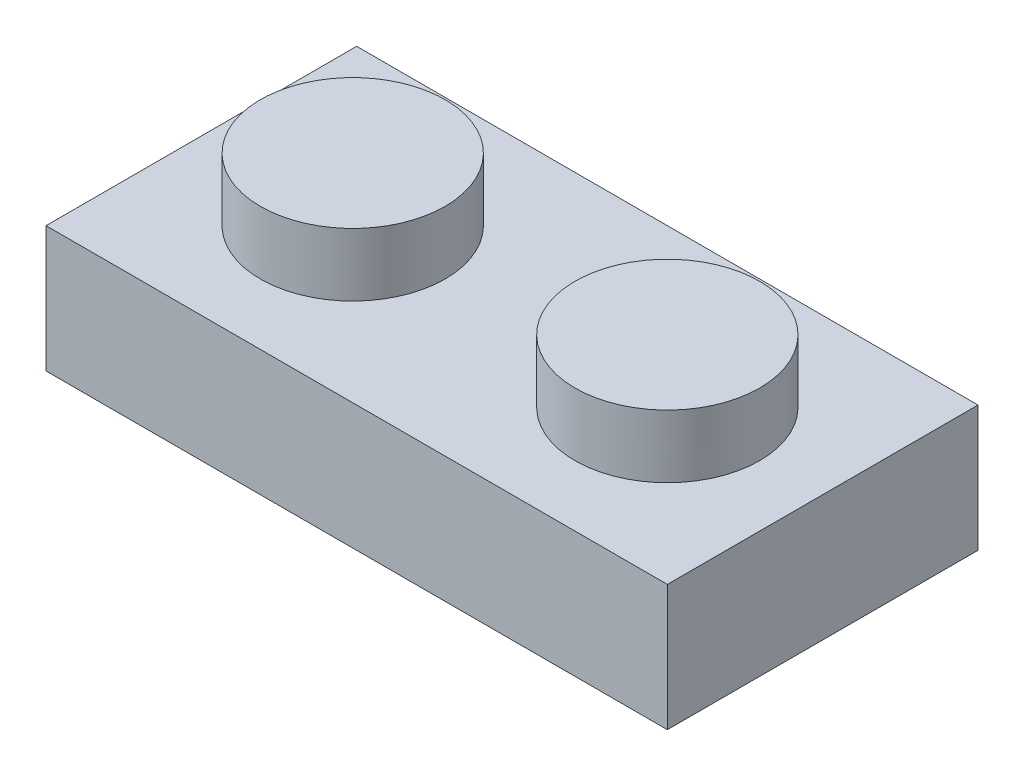
ISO-10303-21;
HEADER;
FILE_DESCRIPTION(('STEP AP214'),'2;1');
FILE_NAME('part.step','',(''),(''),'','','');
FILE_SCHEMA(('AUTOMOTIVE_DESIGN { 1 0 10303 214 1 1 1 1 }'));
ENDSEC;
DATA;
#1=APPLICATION_CONTEXT('core data for automotive mechanical design processes');
#2=APPLICATION_PROTOCOL_DEFINITION('international standard','automotive_design',2000,#1);
#3=PRODUCT_CONTEXT('',#1,'mechanical');
#4=PRODUCT('Part','Part','',(#3));
#5=PRODUCT_RELATED_PRODUCT_CATEGORY('part','',(#4));
#6=PRODUCT_DEFINITION_FORMATION('','',#4);
#7=PRODUCT_DEFINITION_CONTEXT('part definition',#1,'design');
#8=PRODUCT_DEFINITION('design','',#6,#7);
#9=PRODUCT_DEFINITION_SHAPE('','',#8);
#10=(LENGTH_UNIT() NAMED_UNIT(*) SI_UNIT(.MILLI.,.METRE.));
#11=(NAMED_UNIT(*) PLANE_ANGLE_UNIT() SI_UNIT($,.RADIAN.));
#12=(NAMED_UNIT(*) SI_UNIT($,.STERADIAN.) SOLID_ANGLE_UNIT());
#13=UNCERTAINTY_MEASURE_WITH_UNIT(LENGTH_MEASURE(1.E-05),#10,'distance_accuracy_value','');
#14=(GEOMETRIC_REPRESENTATION_CONTEXT(3) GLOBAL_UNCERTAINTY_ASSIGNED_CONTEXT((#13)) GLOBAL_UNIT_ASSIGNED_CONTEXT((#10,
#11,#12)) REPRESENTATION_CONTEXT('',''));
#15=CARTESIAN_POINT('',(0.,0.,0.));
#16=DIRECTION('',(0.,0.,1.));
#17=DIRECTION('',(1.,0.,0.));
#18=AXIS2_PLACEMENT_3D('',#15,#16,#17);
#19=CARTESIAN_POINT('',(16.4819672131147,0.,7.9));
#20=DIRECTION('',(-1.,0.,0.));
#21=DIRECTION('',(0.,0.,1.));
#22=AXIS2_PLACEMENT_3D('',#19,#20,#21);
#23=PLANE('',#22);
#24=DIRECTION('',(0.,-1.,0.));
#25=VECTOR('',#24,1.);
#26=CARTESIAN_POINT('',(16.4819672131147,35.7679015680186,0.));
#27=LINE('',#26,#25);
#28=CARTESIAN_POINT('',(16.4819672131147,3.2,0.));
#29=VERTEX_POINT('',#28);
#30=CARTESIAN_POINT('',(16.4819672131147,0.,0.));
#31=VERTEX_POINT('',#30);
#32=EDGE_CURVE('E215',#29,#31,#27,.T.);
#33=ORIENTED_EDGE('',*,*,#32,.F.);
#34=DIRECTION('',(0.,0.,-1.));
#35=VECTOR('',#34,1.);
#36=CARTESIAN_POINT('',(16.4819672131147,3.2,7.9));
#37=LINE('',#36,#35);
#38=CARTESIAN_POINT('',(16.4819672131147,3.2,7.9));
#39=VERTEX_POINT('',#38);
#40=EDGE_CURVE('E162',#39,#29,#37,.T.);
#41=ORIENTED_EDGE('',*,*,#40,.F.);
#42=DIRECTION('',(0.,1.,0.));
#43=VECTOR('',#42,1.);
#44=CARTESIAN_POINT('',(16.4819672131147,0.,7.9));
#45=LINE('',#44,#43);
#46=CARTESIAN_POINT('',(16.4819672131147,0.,7.9));
#47=VERTEX_POINT('',#46);
#48=EDGE_CURVE('E155',#47,#39,#45,.T.);
#49=ORIENTED_EDGE('',*,*,#48,.F.);
#50=DIRECTION('',(0.,0.,-1.));
#51=VECTOR('',#50,1.);
#52=CARTESIAN_POINT('',(16.4819672131147,0.,7.9));
#53=LINE('',#52,#51);
#54=EDGE_CURVE('E165',#47,#31,#53,.T.);
#55=ORIENTED_EDGE('',*,*,#54,.T.);
#56=EDGE_LOOP('',(#33,#41,#49,#55));
#57=FACE_BOUND('',#56,.T.);
#58=ADVANCED_FACE('F45',(#57),#23,.F.);
#59=CARTESIAN_POINT('',(0.681967213114738,0.,7.9));
#60=DIRECTION('',(0.,1.,0.));
#61=DIRECTION('',(0.,0.,1.));
#62=AXIS2_PLACEMENT_3D('',#59,#60,#61);
#63=PLANE('',#62);
#64=DIRECTION('',(0.,0.,-1.));
#65=VECTOR('',#64,1.);
#66=CARTESIAN_POINT('',(0.681967213114738,0.,7.9));
#67=LINE('',#66,#65);
#68=CARTESIAN_POINT('',(0.681967213114738,0.,7.9));
#69=VERTEX_POINT('',#68);
#70=CARTESIAN_POINT('',(0.681967213114738,0.,0.));
#71=VERTEX_POINT('',#70);
#72=EDGE_CURVE('E168',#69,#71,#67,.T.);
#73=ORIENTED_EDGE('',*,*,#72,.T.);
#74=DIRECTION('',(-1.,0.,0.));
#75=VECTOR('',#74,1.);
#76=CARTESIAN_POINT('',(0.681967213114738,0.,0.));
#77=LINE('',#76,#75);
#78=EDGE_CURVE('E203',#31,#71,#77,.T.);
#79=ORIENTED_EDGE('',*,*,#78,.F.);
#80=ORIENTED_EDGE('',*,*,#54,.F.);
#81=DIRECTION('',(1.,0.,0.));
#82=VECTOR('',#81,1.);
#83=CARTESIAN_POINT('',(0.681967213114738,0.,7.9));
#84=LINE('',#83,#82);
#85=EDGE_CURVE('E153',#69,#47,#84,.T.);
#86=ORIENTED_EDGE('',*,*,#85,.F.);
#87=EDGE_LOOP('',(#73,#79,#80,#86));
#88=FACE_BOUND('',#87,.T.);
#89=DIRECTION('',(-1.,0.,0.));
#90=VECTOR('',#89,1.);
#91=CARTESIAN_POINT('',(7.38292019553601,0.,1.19904701757875));
#92=LINE('',#91,#90);
#93=CARTESIAN_POINT('',(15.2819672131147,0.,1.19904701757875));
#94=VERTEX_POINT('',#93);
#95=CARTESIAN_POINT('',(1.88196721311474,0.,1.19904701757875));
#96=VERTEX_POINT('',#95);
#97=EDGE_CURVE('E112',#94,#96,#92,.T.);
#98=ORIENTED_EDGE('',*,*,#97,.T.);
#99=DIRECTION('',(0.,0.,-1.));
#100=VECTOR('',#99,1.);
#101=CARTESIAN_POINT('',(1.88196721311474,0.,7.9));
#102=LINE('',#101,#100);
#103=CARTESIAN_POINT('',(1.88196721311474,0.,6.7));
#104=VERTEX_POINT('',#103);
#105=EDGE_CURVE('E117',#104,#96,#102,.T.);
#106=ORIENTED_EDGE('',*,*,#105,.F.);
#107=DIRECTION('',(1.,0.,0.));
#108=VECTOR('',#107,1.);
#109=CARTESIAN_POINT('',(0.,0.,6.7));
#110=LINE('',#109,#108);
#111=CARTESIAN_POINT('',(15.2819672131147,0.,6.7));
#112=VERTEX_POINT('',#111);
#113=EDGE_CURVE('E143',#104,#112,#110,.T.);
#114=ORIENTED_EDGE('',*,*,#113,.T.);
#115=DIRECTION('',(0.,0.,-1.));
#116=VECTOR('',#115,1.);
#117=CARTESIAN_POINT('',(15.2819672131147,0.,7.9));
#118=LINE('',#117,#116);
#119=EDGE_CURVE('E118',#112,#94,#118,.T.);
#120=ORIENTED_EDGE('',*,*,#119,.T.);
#121=EDGE_LOOP('',(#98,#106,#114,#120));
#122=FACE_BOUND('',#121,.T.);
#123=ADVANCED_FACE('F114',(#88,#122),#63,.F.);
#124=CARTESIAN_POINT('',(0.681967213114738,3.2,7.9));
#125=DIRECTION('',(0.,-1.,0.));
#126=DIRECTION('',(1.,0.,0.));
#127=AXIS2_PLACEMENT_3D('',#124,#125,#126);
#128=PLANE('',#127);
#129=CARTESIAN_POINT('',(12.5819672131147,3.2,4.));
#130=DIRECTION('',(0.,-1.,0.));
#131=DIRECTION('',(1.,0.,0.));
#132=AXIS2_PLACEMENT_3D('',#129,#130,#131);
#133=CIRCLE('',#132,2.35);
#134=CARTESIAN_POINT('',(14.9319672131147,3.2,4.));
#135=VERTEX_POINT('',#134);
#136=EDGE_CURVE('E174',#135,#135,#133,.F.);
#137=ORIENTED_EDGE('',*,*,#136,.F.);
#138=EDGE_LOOP('',(#137));
#139=FACE_BOUND('',#138,.T.);
#140=CARTESIAN_POINT('',(4.58196721311474,3.2,4.));
#141=DIRECTION('',(0.,-1.,0.));
#142=DIRECTION('',(1.,0.,0.));
#143=AXIS2_PLACEMENT_3D('',#140,#141,#142);
#144=CIRCLE('',#143,2.35);
#145=CARTESIAN_POINT('',(6.93196721311474,3.2,4.));
#146=VERTEX_POINT('',#145);
#147=EDGE_CURVE('E171',#146,#146,#144,.F.);
#148=ORIENTED_EDGE('',*,*,#147,.F.);
#149=EDGE_LOOP('',(#148));
#150=FACE_BOUND('',#149,.T.);
#151=DIRECTION('',(1.,0.,0.));
#152=VECTOR('',#151,1.);
#153=CARTESIAN_POINT('',(0.681967213114738,3.2,0.));
#154=LINE('',#153,#152);
#155=CARTESIAN_POINT('',(0.681967213114738,3.2,0.));
#156=VERTEX_POINT('',#155);
#157=EDGE_CURVE('E196',#156,#29,#154,.T.);
#158=ORIENTED_EDGE('',*,*,#157,.F.);
#159=DIRECTION('',(0.,0.,-1.));
#160=VECTOR('',#159,1.);
#161=CARTESIAN_POINT('',(0.681967213114738,3.2,7.9));
#162=LINE('',#161,#160);
#163=CARTESIAN_POINT('',(0.681967213114738,3.2,7.9));
#164=VERTEX_POINT('',#163);
#165=EDGE_CURVE('E159',#164,#156,#162,.T.);
#166=ORIENTED_EDGE('',*,*,#165,.F.);
#167=DIRECTION('',(-1.,0.,0.));
#168=VECTOR('',#167,1.);
#169=CARTESIAN_POINT('',(0.681967213114738,3.2,7.9));
#170=LINE('',#169,#168);
#171=EDGE_CURVE('E157',#39,#164,#170,.T.);
#172=ORIENTED_EDGE('',*,*,#171,.F.);
#173=ORIENTED_EDGE('',*,*,#40,.T.);
#174=EDGE_LOOP('',(#158,#166,#172,#173));
#175=FACE_BOUND('',#174,.T.);
#176=ADVANCED_FACE('F187',(#139,#150,#175),#128,.F.);
#177=CARTESIAN_POINT('',(15.2819672131147,0.,7.9));
#178=DIRECTION('',(-1.,0.,0.));
#179=DIRECTION('',(0.,0.,1.));
#180=AXIS2_PLACEMENT_3D('',#177,#178,#179);
#181=PLANE('',#180);
#182=DIRECTION('',(0.,-1.,0.));
#183=VECTOR('',#182,1.);
#184=CARTESIAN_POINT('',(15.2819672131147,2.,1.19904701757875));
#185=LINE('',#184,#183);
#186=CARTESIAN_POINT('',(15.2819672131147,2.,1.19904701757875));
#187=VERTEX_POINT('',#186);
#188=EDGE_CURVE('E61',#187,#94,#185,.T.);
#189=ORIENTED_EDGE('',*,*,#188,.T.);
#190=ORIENTED_EDGE('',*,*,#119,.F.);
#191=DIRECTION('',(0.,1.,0.));
#192=VECTOR('',#191,1.);
#193=CARTESIAN_POINT('',(15.2819672131147,0.,6.7));
#194=LINE('',#193,#192);
#195=CARTESIAN_POINT('',(15.2819672131147,2.,6.7));
#196=VERTEX_POINT('',#195);
#197=EDGE_CURVE('E145',#112,#196,#194,.T.);
#198=ORIENTED_EDGE('',*,*,#197,.T.);
#199=DIRECTION('',(0.,0.,-1.));
#200=VECTOR('',#199,1.);
#201=CARTESIAN_POINT('',(15.2819672131147,2.,7.9));
#202=LINE('',#201,#200);
#203=EDGE_CURVE('E137',#196,#187,#202,.T.);
#204=ORIENTED_EDGE('',*,*,#203,.T.);
#205=EDGE_LOOP('',(#189,#190,#198,#204));
#206=FACE_BOUND('',#205,.T.);
#207=ADVANCED_FACE('F190',(#206),#181,.T.);
#208=CARTESIAN_POINT('',(0.681967213114738,2.,7.9));
#209=DIRECTION('',(0.,-1.,0.));
#210=DIRECTION('',(1.,0.,0.));
#211=AXIS2_PLACEMENT_3D('',#208,#209,#210);
#212=PLANE('',#211);
#213=CARTESIAN_POINT('',(8.58196721311474,2.,4.));
#214=DIRECTION('',(0.,-1.,0.));
#215=DIRECTION('',(1.,0.,0.));
#216=AXIS2_PLACEMENT_3D('',#213,#214,#215);
#217=CIRCLE('',#216,1.25);
#218=CARTESIAN_POINT('',(9.83196721311474,2.,4.));
#219=VERTEX_POINT('',#218);
#220=EDGE_CURVE('E49',#219,#219,#217,.F.);
#221=ORIENTED_EDGE('',*,*,#220,.T.);
#222=EDGE_LOOP('',(#221));
#223=FACE_BOUND('',#222,.T.);
#224=DIRECTION('',(0.,0.,-1.));
#225=VECTOR('',#224,1.);
#226=CARTESIAN_POINT('',(1.88196721311474,2.,7.9));
#227=LINE('',#226,#225);
#228=CARTESIAN_POINT('',(1.88196721311474,2.,6.7));
#229=VERTEX_POINT('',#228);
#230=CARTESIAN_POINT('',(1.88196721311474,2.,1.19904701757875));
#231=VERTEX_POINT('',#230);
#232=EDGE_CURVE('E224',#229,#231,#227,.T.);
#233=ORIENTED_EDGE('',*,*,#232,.T.);
#234=DIRECTION('',(-1.,0.,0.));
#235=VECTOR('',#234,1.);
#236=CARTESIAN_POINT('',(7.38292019553601,2.,1.19904701757875));
#237=LINE('',#236,#235);
#238=EDGE_CURVE('E69',#187,#231,#237,.T.);
#239=ORIENTED_EDGE('',*,*,#238,.F.);
#240=ORIENTED_EDGE('',*,*,#203,.F.);
#241=DIRECTION('',(-1.,0.,0.));
#242=VECTOR('',#241,1.);
#243=CARTESIAN_POINT('',(0.,2.,6.7));
#244=LINE('',#243,#242);
#245=EDGE_CURVE('E226',#196,#229,#244,.T.);
#246=ORIENTED_EDGE('',*,*,#245,.T.);
#247=EDGE_LOOP('',(#233,#239,#240,#246));
#248=FACE_BOUND('',#247,.T.);
#249=CARTESIAN_POINT('',(12.5819672131147,2.,4.));
#250=DIRECTION('',(0.,-1.,0.));
#251=DIRECTION('',(1.,0.,0.));
#252=AXIS2_PLACEMENT_3D('',#249,#250,#251);
#253=CIRCLE('',#252,1.15);
#254=CARTESIAN_POINT('',(13.7319672131147,2.,4.));
#255=VERTEX_POINT('',#254);
#256=EDGE_CURVE('E135',#255,#255,#253,.F.);
#257=ORIENTED_EDGE('',*,*,#256,.T.);
#258=EDGE_LOOP('',(#257));
#259=FACE_BOUND('',#258,.T.);
#260=CARTESIAN_POINT('',(4.58196721311474,2.,4.));
#261=DIRECTION('',(0.,-1.,0.));
#262=DIRECTION('',(1.,0.,0.));
#263=AXIS2_PLACEMENT_3D('',#260,#261,#262);
#264=CIRCLE('',#263,1.15);
#265=CARTESIAN_POINT('',(5.73196721311474,2.,4.));
#266=VERTEX_POINT('',#265);
#267=EDGE_CURVE('E132',#266,#266,#264,.F.);
#268=ORIENTED_EDGE('',*,*,#267,.T.);
#269=EDGE_LOOP('',(#268));
#270=FACE_BOUND('',#269,.T.);
#271=ADVANCED_FACE('F232',(#223,#248,#259,#270),#212,.T.);
#272=CARTESIAN_POINT('',(12.5819672131147,4.8,4.));
#273=DIRECTION('',(0.,1.,0.));
#274=DIRECTION('',(0.,0.,1.));
#275=AXIS2_PLACEMENT_3D('',#272,#273,#274);
#276=PLANE('',#275);
#277=CARTESIAN_POINT('',(12.5819672131147,4.8,4.));
#278=DIRECTION('',(0.,1.,0.));
#279=DIRECTION('',(0.,0.,1.));
#280=AXIS2_PLACEMENT_3D('',#277,#278,#279);
#281=CIRCLE('',#280,2.35);
#282=CARTESIAN_POINT('',(12.5819672131147,4.8,6.35));
#283=VERTEX_POINT('',#282);
#284=EDGE_CURVE('E54',#283,#283,#281,.T.);
#285=ORIENTED_EDGE('',*,*,#284,.T.);
#286=EDGE_LOOP('',(#285));
#287=FACE_BOUND('',#286,.T.);
#288=ADVANCED_FACE('F47',(#287),#276,.T.);
#289=CARTESIAN_POINT('',(12.5819672131147,4.8,4.));
#290=DIRECTION('',(0.,-1.,0.));
#291=DIRECTION('',(0.,0.,-1.));
#292=AXIS2_PLACEMENT_3D('',#289,#290,#291);
#293=CYLINDRICAL_SURFACE('',#292,2.35);
#294=ORIENTED_EDGE('',*,*,#284,.F.);
#295=EDGE_LOOP('',(#294));
#296=FACE_BOUND('',#295,.T.);
#297=ORIENTED_EDGE('',*,*,#136,.T.);
#298=EDGE_LOOP('',(#297));
#299=FACE_BOUND('',#298,.T.);
#300=ADVANCED_FACE('F181',(#296,#299),#293,.T.);
#301=CARTESIAN_POINT('',(0.681967213114738,0.,7.9));
#302=DIRECTION('',(1.,0.,0.));
#303=DIRECTION('',(0.,0.,-1.));
#304=AXIS2_PLACEMENT_3D('',#301,#302,#303);
#305=PLANE('',#304);
#306=ORIENTED_EDGE('',*,*,#165,.T.);
#307=DIRECTION('',(0.,-1.,0.));
#308=VECTOR('',#307,1.);
#309=CARTESIAN_POINT('',(0.681967213114738,4.8,0.));
#310=LINE('',#309,#308);
#311=EDGE_CURVE('E120',#156,#71,#310,.T.);
#312=ORIENTED_EDGE('',*,*,#311,.T.);
#313=ORIENTED_EDGE('',*,*,#72,.F.);
#314=DIRECTION('',(0.,-1.,0.));
#315=VECTOR('',#314,1.);
#316=CARTESIAN_POINT('',(0.681967213114738,0.,7.9));
#317=LINE('',#316,#315);
#318=EDGE_CURVE('E149',#164,#69,#317,.T.);
#319=ORIENTED_EDGE('',*,*,#318,.F.);
#320=EDGE_LOOP('',(#306,#312,#313,#319));
#321=FACE_BOUND('',#320,.T.);
#322=ADVANCED_FACE('F184',(#321),#305,.F.);
#323=CARTESIAN_POINT('',(0.,0.,7.9));
#324=DIRECTION('',(0.,0.,-1.));
#325=DIRECTION('',(-1.,0.,0.));
#326=AXIS2_PLACEMENT_3D('',#323,#324,#325);
#327=PLANE('',#326);
#328=ORIENTED_EDGE('',*,*,#318,.T.);
#329=ORIENTED_EDGE('',*,*,#85,.T.);
#330=ORIENTED_EDGE('',*,*,#48,.T.);
#331=ORIENTED_EDGE('',*,*,#171,.T.);
#332=EDGE_LOOP('',(#328,#329,#330,#331));
#333=FACE_BOUND('',#332,.T.);
#334=ADVANCED_FACE('F211',(#333),#327,.F.);
#335=CARTESIAN_POINT('',(4.58196721311474,4.8,4.));
#336=DIRECTION('',(0.,-1.,0.));
#337=DIRECTION('',(0.,0.,-1.));
#338=AXIS2_PLACEMENT_3D('',#335,#336,#337);
#339=CYLINDRICAL_SURFACE('',#338,2.35);
#340=CARTESIAN_POINT('',(4.58196721311474,4.8,4.));
#341=DIRECTION('',(0.,1.,0.));
#342=DIRECTION('',(0.,0.,1.));
#343=AXIS2_PLACEMENT_3D('',#340,#341,#342);
#344=CIRCLE('',#343,2.35);
#345=CARTESIAN_POINT('',(4.58196721311474,4.8,6.35));
#346=VERTEX_POINT('',#345);
#347=EDGE_CURVE('E146',#346,#346,#344,.T.);
#348=ORIENTED_EDGE('',*,*,#347,.F.);
#349=EDGE_LOOP('',(#348));
#350=FACE_BOUND('',#349,.T.);
#351=ORIENTED_EDGE('',*,*,#147,.T.);
#352=EDGE_LOOP('',(#351));
#353=FACE_BOUND('',#352,.T.);
#354=ADVANCED_FACE('F266',(#350,#353),#339,.T.);
#355=CARTESIAN_POINT('',(4.58196721311474,4.8,4.));
#356=DIRECTION('',(0.,1.,0.));
#357=DIRECTION('',(0.,0.,1.));
#358=AXIS2_PLACEMENT_3D('',#355,#356,#357);
#359=PLANE('',#358);
#360=ORIENTED_EDGE('',*,*,#347,.T.);
#361=EDGE_LOOP('',(#360));
#362=FACE_BOUND('',#361,.T.);
#363=ADVANCED_FACE('F271',(#362),#359,.T.);
#364=CARTESIAN_POINT('',(12.5819672131147,3.6,4.));
#365=DIRECTION('',(0.,1.,0.));
#366=DIRECTION('',(0.,0.,1.));
#367=AXIS2_PLACEMENT_3D('',#364,#365,#366);
#368=PLANE('',#367);
#369=CARTESIAN_POINT('',(12.5819672131147,3.6,4.));
#370=DIRECTION('',(0.,1.,0.));
#371=DIRECTION('',(0.,0.,1.));
#372=AXIS2_PLACEMENT_3D('',#369,#370,#371);
#373=CIRCLE('',#372,1.15);
#374=CARTESIAN_POINT('',(12.5819672131147,3.6,5.15));
#375=VERTEX_POINT('',#374);
#376=EDGE_CURVE('E150',#375,#375,#373,.T.);
#377=ORIENTED_EDGE('',*,*,#376,.F.);
#378=EDGE_LOOP('',(#377));
#379=FACE_BOUND('',#378,.T.);
#380=ADVANCED_FACE('F277',(#379),#368,.F.);
#381=CARTESIAN_POINT('',(12.5819672131147,4.8,4.));
#382=DIRECTION('',(0.,-1.,0.));
#383=DIRECTION('',(0.,0.,-1.));
#384=AXIS2_PLACEMENT_3D('',#381,#382,#383);
#385=CYLINDRICAL_SURFACE('',#384,1.15);
#386=ORIENTED_EDGE('',*,*,#376,.T.);
#387=EDGE_LOOP('',(#386));
#388=FACE_BOUND('',#387,.T.);
#389=ORIENTED_EDGE('',*,*,#256,.F.);
#390=EDGE_LOOP('',(#389));
#391=FACE_BOUND('',#390,.T.);
#392=ADVANCED_FACE('F246',(#388,#391),#385,.F.);
#393=CARTESIAN_POINT('',(1.88196721311474,0.,7.9));
#394=DIRECTION('',(1.,0.,0.));
#395=DIRECTION('',(0.,0.,-1.));
#396=AXIS2_PLACEMENT_3D('',#393,#394,#395);
#397=PLANE('',#396);
#398=DIRECTION('',(0.,-1.,0.));
#399=VECTOR('',#398,1.);
#400=CARTESIAN_POINT('',(1.88196721311474,4.802,1.19904701757875));
#401=LINE('',#400,#399);
#402=EDGE_CURVE('E123',#231,#96,#401,.T.);
#403=ORIENTED_EDGE('',*,*,#402,.F.);
#404=ORIENTED_EDGE('',*,*,#232,.F.);
#405=DIRECTION('',(0.,-1.,0.));
#406=VECTOR('',#405,1.);
#407=CARTESIAN_POINT('',(1.88196721311474,0.,6.7));
#408=LINE('',#407,#406);
#409=EDGE_CURVE('E130',#229,#104,#408,.T.);
#410=ORIENTED_EDGE('',*,*,#409,.T.);
#411=ORIENTED_EDGE('',*,*,#105,.T.);
#412=EDGE_LOOP('',(#403,#404,#410,#411));
#413=FACE_BOUND('',#412,.T.);
#414=ADVANCED_FACE('F128',(#413),#397,.T.);
#415=CARTESIAN_POINT('',(0.,0.,6.7));
#416=DIRECTION('',(0.,0.,-1.));
#417=DIRECTION('',(-1.,0.,0.));
#418=AXIS2_PLACEMENT_3D('',#415,#416,#417);
#419=PLANE('',#418);
#420=ORIENTED_EDGE('',*,*,#409,.F.);
#421=ORIENTED_EDGE('',*,*,#245,.F.);
#422=ORIENTED_EDGE('',*,*,#197,.F.);
#423=ORIENTED_EDGE('',*,*,#113,.F.);
#424=EDGE_LOOP('',(#420,#421,#422,#423));
#425=FACE_BOUND('',#424,.T.);
#426=ADVANCED_FACE('F234',(#425),#419,.T.);
#427=CARTESIAN_POINT('',(4.58196721311474,4.8,4.));
#428=DIRECTION('',(0.,-1.,0.));
#429=DIRECTION('',(0.,0.,-1.));
#430=AXIS2_PLACEMENT_3D('',#427,#428,#429);
#431=CYLINDRICAL_SURFACE('',#430,1.15);
#432=CARTESIAN_POINT('',(4.58196721311474,3.6,4.));
#433=DIRECTION('',(0.,1.,0.));
#434=DIRECTION('',(0.,0.,1.));
#435=AXIS2_PLACEMENT_3D('',#432,#433,#434);
#436=CIRCLE('',#435,1.15);
#437=CARTESIAN_POINT('',(4.58196721311474,3.6,5.15));
#438=VERTEX_POINT('',#437);
#439=EDGE_CURVE('E140',#438,#438,#436,.T.);
#440=ORIENTED_EDGE('',*,*,#439,.T.);
#441=EDGE_LOOP('',(#440));
#442=FACE_BOUND('',#441,.T.);
#443=ORIENTED_EDGE('',*,*,#267,.F.);
#444=EDGE_LOOP('',(#443));
#445=FACE_BOUND('',#444,.T.);
#446=ADVANCED_FACE('F236',(#442,#445),#431,.F.);
#447=CARTESIAN_POINT('',(4.58196721311474,3.6,4.));
#448=DIRECTION('',(0.,1.,0.));
#449=DIRECTION('',(0.,0.,1.));
#450=AXIS2_PLACEMENT_3D('',#447,#448,#449);
#451=PLANE('',#450);
#452=ORIENTED_EDGE('',*,*,#439,.F.);
#453=EDGE_LOOP('',(#452));
#454=FACE_BOUND('',#453,.T.);
#455=ADVANCED_FACE('F242',(#454),#451,.F.);
#456=CARTESIAN_POINT('',(8.58196721311474,35.7679015680186,0.));
#457=DIRECTION('',(0.,0.,-1.));
#458=DIRECTION('',(-1.,0.,0.));
#459=AXIS2_PLACEMENT_3D('',#456,#457,#458);
#460=PLANE('',#459);
#461=ORIENTED_EDGE('',*,*,#78,.T.);
#462=ORIENTED_EDGE('',*,*,#311,.F.);
#463=ORIENTED_EDGE('',*,*,#157,.T.);
#464=ORIENTED_EDGE('',*,*,#32,.T.);
#465=EDGE_LOOP('',(#461,#462,#463,#464));
#466=FACE_BOUND('',#465,.T.);
#467=ADVANCED_FACE('F206',(#466),#460,.T.);
#468=CARTESIAN_POINT('',(7.38292019553601,2.,1.19904701757875));
#469=DIRECTION('',(0.,0.,1.));
#470=DIRECTION('',(1.,0.,0.));
#471=AXIS2_PLACEMENT_3D('',#468,#469,#470);
#472=PLANE('',#471);
#473=ORIENTED_EDGE('',*,*,#97,.F.);
#474=ORIENTED_EDGE('',*,*,#188,.F.);
#475=ORIENTED_EDGE('',*,*,#238,.T.);
#476=ORIENTED_EDGE('',*,*,#402,.T.);
#477=EDGE_LOOP('',(#473,#474,#475,#476));
#478=FACE_BOUND('',#477,.T.);
#479=ADVANCED_FACE('F124',(#478),#472,.T.);
#480=CARTESIAN_POINT('',(8.58196721311474,1.7,4.));
#481=DIRECTION('',(0.,-1.,0.));
#482=DIRECTION('',(1.,0.,0.));
#483=AXIS2_PLACEMENT_3D('',#480,#481,#482);
#484=PLANE('',#483);
#485=CARTESIAN_POINT('',(8.58196721311474,1.7,4.));
#486=DIRECTION('',(0.,-1.,0.));
#487=DIRECTION('',(1.,0.,0.));
#488=AXIS2_PLACEMENT_3D('',#485,#486,#487);
#489=CIRCLE('',#488,1.25);
#490=CARTESIAN_POINT('',(9.83196721311474,1.7,4.));
#491=VERTEX_POINT('',#490);
#492=EDGE_CURVE('E313',#491,#491,#489,.T.);
#493=ORIENTED_EDGE('',*,*,#492,.T.);
#494=EDGE_LOOP('',(#493));
#495=FACE_BOUND('',#494,.T.);
#496=CARTESIAN_POINT('',(8.58196721311474,1.7,4.));
#497=DIRECTION('',(0.,-1.,0.));
#498=DIRECTION('',(1.,0.,0.));
#499=AXIS2_PLACEMENT_3D('',#496,#497,#498);
#500=CIRCLE('',#499,0.75);
#501=CARTESIAN_POINT('',(9.33196721311474,1.7,4.));
#502=VERTEX_POINT('',#501);
#503=EDGE_CURVE('E311',#502,#502,#500,.T.);
#504=ORIENTED_EDGE('',*,*,#503,.F.);
#505=EDGE_LOOP('',(#504));
#506=FACE_BOUND('',#505,.T.);
#507=ADVANCED_FACE('F324',(#495,#506),#484,.T.);
#508=CARTESIAN_POINT('',(8.58196721311474,1.7,4.));
#509=DIRECTION('',(0.,1.,0.));
#510=DIRECTION('',(-1.,0.,0.));
#511=AXIS2_PLACEMENT_3D('',#508,#509,#510);
#512=CYLINDRICAL_SURFACE('',#511,1.25);
#513=ORIENTED_EDGE('',*,*,#220,.F.);
#514=EDGE_LOOP('',(#513));
#515=FACE_BOUND('',#514,.T.);
#516=ORIENTED_EDGE('',*,*,#492,.F.);
#517=EDGE_LOOP('',(#516));
#518=FACE_BOUND('',#517,.T.);
#519=ADVANCED_FACE('F304',(#515,#518),#512,.T.);
#520=CARTESIAN_POINT('',(8.58196721311474,1.7,4.));
#521=DIRECTION('',(0.,1.,0.));
#522=DIRECTION('',(-1.,0.,0.));
#523=AXIS2_PLACEMENT_3D('',#520,#521,#522);
#524=CYLINDRICAL_SURFACE('',#523,0.75);
#525=CARTESIAN_POINT('',(8.58196721311474,2.,4.));
#526=DIRECTION('',(0.,-1.,0.));
#527=DIRECTION('',(1.,0.,0.));
#528=AXIS2_PLACEMENT_3D('',#525,#526,#527);
#529=CIRCLE('',#528,0.75);
#530=CARTESIAN_POINT('',(9.33196721311474,2.,4.));
#531=VERTEX_POINT('',#530);
#532=EDGE_CURVE('E11',#531,#531,#529,.F.);
#533=ORIENTED_EDGE('',*,*,#532,.T.);
#534=EDGE_LOOP('',(#533));
#535=FACE_BOUND('',#534,.T.);
#536=ORIENTED_EDGE('',*,*,#503,.T.);
#537=EDGE_LOOP('',(#536));
#538=FACE_BOUND('',#537,.T.);
#539=ADVANCED_FACE('F299',(#535,#538),#524,.F.);
#540=ORIENTED_EDGE('',*,*,#532,.F.);
#541=EDGE_LOOP('',(#540));
#542=FACE_BOUND('',#541,.T.);
#543=ADVANCED_FACE('F291',(#542),#212,.T.);
#544=CLOSED_SHELL('',(#58,#123,#176,#207,#271,#288,#300,#322,#334,#354,#363,#380,#392,#414,#426,
#446,#455,#467,#479,#507,#519,#539,#543));
#545=MANIFOLD_SOLID_BREP('B2',#544);
#546=ADVANCED_BREP_SHAPE_REPRESENTATION('',(#18,#545),#14);
#547=SHAPE_DEFINITION_REPRESENTATION(#9,#546);
ENDSEC;
END-ISO-10303-21;
